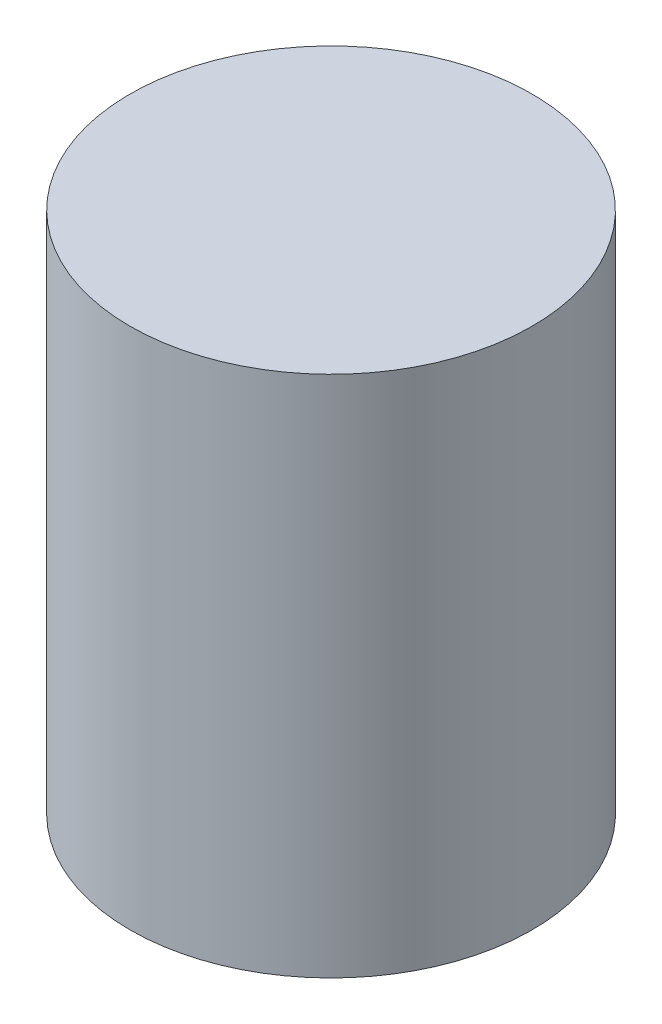
ISO-10303-21;
HEADER;
FILE_DESCRIPTION(('STEP AP214'),'2;1');
FILE_NAME('part.step','',(''),(''),'','','');
FILE_SCHEMA(('AUTOMOTIVE_DESIGN { 1 0 10303 214 1 1 1 1 }'));
ENDSEC;
DATA;
#1=APPLICATION_CONTEXT('core data for automotive mechanical design processes');
#2=APPLICATION_PROTOCOL_DEFINITION('international standard','automotive_design',2000,#1);
#3=PRODUCT_CONTEXT('',#1,'mechanical');
#4=PRODUCT('Part','Part','',(#3));
#5=PRODUCT_RELATED_PRODUCT_CATEGORY('part','',(#4));
#6=PRODUCT_DEFINITION_FORMATION('','',#4);
#7=PRODUCT_DEFINITION_CONTEXT('part definition',#1,'design');
#8=PRODUCT_DEFINITION('design','',#6,#7);
#9=PRODUCT_DEFINITION_SHAPE('','',#8);
#10=(LENGTH_UNIT() NAMED_UNIT(*) SI_UNIT(.MILLI.,.METRE.));
#11=(NAMED_UNIT(*) PLANE_ANGLE_UNIT() SI_UNIT($,.RADIAN.));
#12=(NAMED_UNIT(*) SI_UNIT($,.STERADIAN.) SOLID_ANGLE_UNIT());
#13=UNCERTAINTY_MEASURE_WITH_UNIT(LENGTH_MEASURE(1.E-05),#10,'distance_accuracy_value','');
#14=(GEOMETRIC_REPRESENTATION_CONTEXT(3) GLOBAL_UNCERTAINTY_ASSIGNED_CONTEXT((#13)) GLOBAL_UNIT_ASSIGNED_CONTEXT((#10,
#11,#12)) REPRESENTATION_CONTEXT('',''));
#15=CARTESIAN_POINT('',(0.,0.,0.));
#16=DIRECTION('',(0.,0.,1.));
#17=DIRECTION('',(1.,0.,0.));
#18=AXIS2_PLACEMENT_3D('',#15,#16,#17);
#19=CARTESIAN_POINT('',(-30.107395374555,11.7,-28.4138543847362));
#20=DIRECTION('',(0.,-1.,0.));
#21=DIRECTION('',(0.,0.,-1.));
#22=AXIS2_PLACEMENT_3D('',#19,#20,#21);
#23=CYLINDRICAL_SURFACE('',#22,4.5);
#24=CARTESIAN_POINT('',(-30.107395374555,11.7,-28.4138543847362));
#25=DIRECTION('',(0.,1.,0.));
#26=DIRECTION('',(0.,0.,1.));
#27=AXIS2_PLACEMENT_3D('',#24,#25,#26);
#28=CIRCLE('',#27,4.5);
#29=CARTESIAN_POINT('',(-30.107395374555,11.7,-23.9138543847362));
#30=VERTEX_POINT('',#29);
#31=EDGE_CURVE('E10',#30,#30,#28,.T.);
#32=ORIENTED_EDGE('',*,*,#31,.F.);
#33=EDGE_LOOP('',(#32));
#34=FACE_BOUND('',#33,.T.);
#35=CARTESIAN_POINT('',(-30.107395374555,0.,-28.4138543847362));
#36=DIRECTION('',(0.,1.,0.));
#37=DIRECTION('',(0.,0.,1.));
#38=AXIS2_PLACEMENT_3D('',#35,#36,#37);
#39=CIRCLE('',#38,4.5);
#40=CARTESIAN_POINT('',(-30.107395374555,0.,-23.9138543847362));
#41=VERTEX_POINT('',#40);
#42=EDGE_CURVE('E40',#41,#41,#39,.T.);
#43=ORIENTED_EDGE('',*,*,#42,.T.);
#44=EDGE_LOOP('',(#43));
#45=FACE_BOUND('',#44,.T.);
#46=ADVANCED_FACE('F37',(#34,#45),#23,.T.);
#47=CARTESIAN_POINT('',(-30.107395374555,11.7,-28.4138543847362));
#48=DIRECTION('',(0.,1.,0.));
#49=DIRECTION('',(0.,0.,1.));
#50=AXIS2_PLACEMENT_3D('',#47,#48,#49);
#51=PLANE('',#50);
#52=ORIENTED_EDGE('',*,*,#31,.T.);
#53=EDGE_LOOP('',(#52));
#54=FACE_BOUND('',#53,.T.);
#55=ADVANCED_FACE('F54',(#54),#51,.T.);
#56=CARTESIAN_POINT('',(-30.107395374555,0.,-28.4138543847362));
#57=DIRECTION('',(0.,1.,0.));
#58=DIRECTION('',(0.,0.,1.));
#59=AXIS2_PLACEMENT_3D('',#56,#57,#58);
#60=PLANE('',#59);
#61=ORIENTED_EDGE('',*,*,#42,.F.);
#62=EDGE_LOOP('',(#61));
#63=FACE_BOUND('',#62,.T.);
#64=ADVANCED_FACE('F52',(#63),#60,.F.);
#65=CLOSED_SHELL('',(#46,#55,#64));
#66=MANIFOLD_SOLID_BREP('B2',#65);
#67=ADVANCED_BREP_SHAPE_REPRESENTATION('',(#18,#66),#14);
#68=SHAPE_DEFINITION_REPRESENTATION(#9,#67);
ENDSEC;
END-ISO-10303-21;
